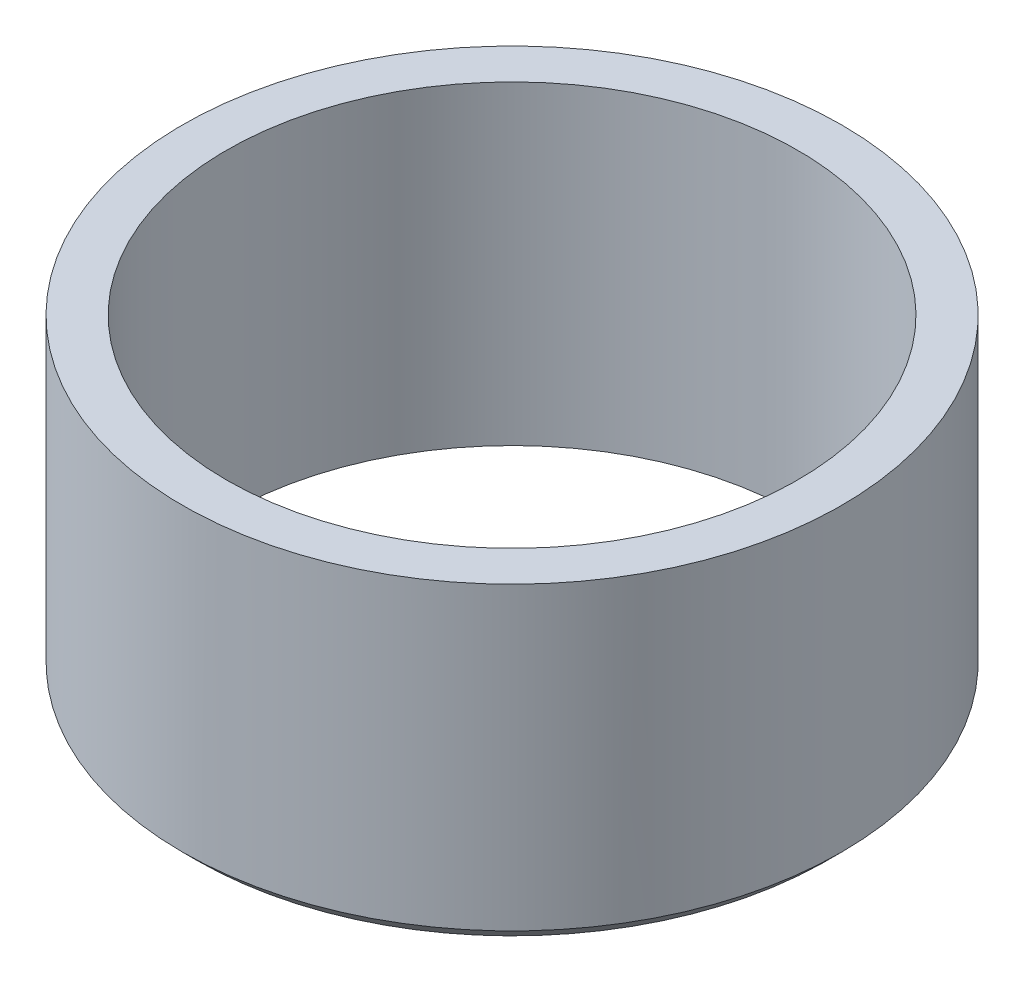
ISO-10303-21;
HEADER;
FILE_DESCRIPTION(('STEP AP214'),'2;1');
FILE_NAME('part.step','',(''),(''),'','','');
FILE_SCHEMA(('AUTOMOTIVE_DESIGN { 1 0 10303 214 1 1 1 1 }'));
ENDSEC;
DATA;
#1=APPLICATION_CONTEXT('core data for automotive mechanical design processes');
#2=APPLICATION_PROTOCOL_DEFINITION('international standard','automotive_design',2000,#1);
#3=PRODUCT_CONTEXT('',#1,'mechanical');
#4=PRODUCT('Part','Part','',(#3));
#5=PRODUCT_RELATED_PRODUCT_CATEGORY('part','',(#4));
#6=PRODUCT_DEFINITION_FORMATION('','',#4);
#7=PRODUCT_DEFINITION_CONTEXT('part definition',#1,'design');
#8=PRODUCT_DEFINITION('design','',#6,#7);
#9=PRODUCT_DEFINITION_SHAPE('','',#8);
#10=(LENGTH_UNIT() NAMED_UNIT(*) SI_UNIT(.MILLI.,.METRE.));
#11=(NAMED_UNIT(*) PLANE_ANGLE_UNIT() SI_UNIT($,.RADIAN.));
#12=(NAMED_UNIT(*) SI_UNIT($,.STERADIAN.) SOLID_ANGLE_UNIT());
#13=UNCERTAINTY_MEASURE_WITH_UNIT(LENGTH_MEASURE(1.E-05),#10,'distance_accuracy_value','');
#14=(GEOMETRIC_REPRESENTATION_CONTEXT(3) GLOBAL_UNCERTAINTY_ASSIGNED_CONTEXT((#13)) GLOBAL_UNIT_ASSIGNED_CONTEXT((#10,
#11,#12)) REPRESENTATION_CONTEXT('',''));
#15=CARTESIAN_POINT('',(0.,0.,0.));
#16=DIRECTION('',(0.,0.,1.));
#17=DIRECTION('',(1.,0.,0.));
#18=AXIS2_PLACEMENT_3D('',#15,#16,#17);
#19=CARTESIAN_POINT('',(0.,4.3,0.));
#20=DIRECTION('',(0.,-1.,0.));
#21=DIRECTION('',(0.,0.,-1.));
#22=AXIS2_PLACEMENT_3D('',#19,#20,#21);
#23=CYLINDRICAL_SURFACE('',#22,4.5);
#24=CARTESIAN_POINT('',(0.,0.200000000000006,0.));
#25=DIRECTION('',(0.,1.,0.));
#26=DIRECTION('',(0.,0.,1.));
#27=AXIS2_PLACEMENT_3D('',#24,#25,#26);
#28=CIRCLE('',#27,4.5);
#29=CARTESIAN_POINT('',(0.,0.200000000000005,-4.5));
#30=VERTEX_POINT('',#29);
#31=EDGE_CURVE('E38',#30,#30,#28,.T.);
#32=CARTESIAN_POINT('',(0.,4.3,0.));
#33=DIRECTION('',(0.,1.,0.));
#34=DIRECTION('',(0.,0.,1.));
#35=AXIS2_PLACEMENT_3D('',#32,#33,#34);
#36=CIRCLE('',#35,4.5);
#37=CARTESIAN_POINT('',(0.,4.3,-4.5));
#38=VERTEX_POINT('',#37);
#39=EDGE_CURVE('E42',#38,#38,#36,.T.);
#40=CARTESIAN_POINT('',(0.,0.200000000000005,-4.5));
#41=CARTESIAN_POINT('',(0.,0.242708333333338,-4.5));
#42=CARTESIAN_POINT('',(0.,0.285416666666671,-4.5));
#43=CARTESIAN_POINT('',(0.,0.370833333333338,-4.5));
#44=CARTESIAN_POINT('',(0.,0.413541666666671,-4.5));
#45=CARTESIAN_POINT('',(0.,0.498958333333337,-4.5));
#46=CARTESIAN_POINT('',(0.,0.54166666666667,-4.5));
#47=CARTESIAN_POINT('',(0.,0.627083333333337,-4.5));
#48=CARTESIAN_POINT('',(0.,0.669791666666671,-4.5));
#49=CARTESIAN_POINT('',(0.,0.755208333333337,-4.5));
#50=CARTESIAN_POINT('',(0.,0.79791666666667,-4.5));
#51=CARTESIAN_POINT('',(0.,0.883333333333337,-4.5));
#52=CARTESIAN_POINT('',(0.,0.92604166666667,-4.5));
#53=CARTESIAN_POINT('',(0.,1.01145833333334,-4.5));
#54=CARTESIAN_POINT('',(0.,1.05416666666667,-4.5));
#55=CARTESIAN_POINT('',(0.,1.13958333333334,-4.5));
#56=CARTESIAN_POINT('',(0.,1.18229166666667,-4.5));
#57=CARTESIAN_POINT('',(0.,1.26770833333334,-4.5));
#58=CARTESIAN_POINT('',(0.,1.31041666666667,-4.5));
#59=CARTESIAN_POINT('',(0.,1.39583333333334,-4.5));
#60=CARTESIAN_POINT('',(0.,1.43854166666667,-4.5));
#61=CARTESIAN_POINT('',(0.,1.52395833333334,-4.5));
#62=CARTESIAN_POINT('',(0.,1.56666666666667,-4.5));
#63=CARTESIAN_POINT('',(0.,1.65208333333334,-4.5));
#64=CARTESIAN_POINT('',(0.,1.69479166666667,-4.5));
#65=CARTESIAN_POINT('',(0.,1.78020833333334,-4.5));
#66=CARTESIAN_POINT('',(0.,1.82291666666667,-4.5));
#67=CARTESIAN_POINT('',(0.,1.90833333333334,-4.5));
#68=CARTESIAN_POINT('',(0.,1.95104166666667,-4.5));
#69=CARTESIAN_POINT('',(0.,2.03645833333334,-4.5));
#70=CARTESIAN_POINT('',(0.,2.07916666666667,-4.5));
#71=CARTESIAN_POINT('',(0.,2.16458333333334,-4.5));
#72=CARTESIAN_POINT('',(0.,2.20729166666667,-4.5));
#73=CARTESIAN_POINT('',(0.,2.29270833333334,-4.5));
#74=CARTESIAN_POINT('',(0.,2.33541666666667,-4.5));
#75=CARTESIAN_POINT('',(0.,2.42083333333334,-4.5));
#76=CARTESIAN_POINT('',(0.,2.46354166666667,-4.5));
#77=CARTESIAN_POINT('',(0.,2.54895833333333,-4.5));
#78=CARTESIAN_POINT('',(0.,2.59166666666667,-4.5));
#79=CARTESIAN_POINT('',(0.,2.67708333333333,-4.5));
#80=CARTESIAN_POINT('',(0.,2.71979166666667,-4.5));
#81=CARTESIAN_POINT('',(0.,2.80520833333333,-4.5));
#82=CARTESIAN_POINT('',(0.,2.84791666666667,-4.5));
#83=CARTESIAN_POINT('',(0.,2.93333333333333,-4.5));
#84=CARTESIAN_POINT('',(0.,2.97604166666667,-4.5));
#85=CARTESIAN_POINT('',(0.,3.06145833333333,-4.5));
#86=CARTESIAN_POINT('',(0.,3.10416666666667,-4.5));
#87=CARTESIAN_POINT('',(0.,3.18958333333333,-4.5));
#88=CARTESIAN_POINT('',(0.,3.23229166666667,-4.5));
#89=CARTESIAN_POINT('',(0.,3.31770833333333,-4.5));
#90=CARTESIAN_POINT('',(0.,3.36041666666667,-4.5));
#91=CARTESIAN_POINT('',(0.,3.44583333333333,-4.5));
#92=CARTESIAN_POINT('',(0.,3.48854166666667,-4.5));
#93=CARTESIAN_POINT('',(0.,3.57395833333333,-4.5));
#94=CARTESIAN_POINT('',(0.,3.61666666666667,-4.5));
#95=CARTESIAN_POINT('',(0.,3.70208333333333,-4.5));
#96=CARTESIAN_POINT('',(0.,3.74479166666667,-4.5));
#97=CARTESIAN_POINT('',(0.,3.83020833333333,-4.5));
#98=CARTESIAN_POINT('',(0.,3.87291666666667,-4.5));
#99=CARTESIAN_POINT('',(0.,3.95833333333333,-4.5));
#100=CARTESIAN_POINT('',(0.,4.00104166666667,-4.5));
#101=CARTESIAN_POINT('',(0.,4.08645833333333,-4.5));
#102=CARTESIAN_POINT('',(0.,4.12916666666667,-4.5));
#103=CARTESIAN_POINT('',(0.,4.21458333333333,-4.5));
#104=CARTESIAN_POINT('',(0.,4.25729166666667,-4.5));
#105=CARTESIAN_POINT('',(0.,4.3,-4.5));
#106=B_SPLINE_CURVE_WITH_KNOTS('',3,(#40,#41,#42,#43,#44,#45,#46,#47,#48,#49,#50,#51,#52,#53,
#54,#55,#56,#57,#58,#59,#60,#61,#62,#63,#64,#65,#66,#67,#68,#69,#70,#71,#72,#73,#74,#75,#76,#77,
#78,#79,#80,#81,#82,#83,#84,#85,#86,#87,#88,#89,#90,#91,#92,#93,#94,#95,#96,#97,#98,#99,#100,
#101,#102,#103,#104,#105),.UNSPECIFIED.,.F.,.F.,(4,2,2,2,2,2,2,2,2,2,2,2,2,2,2,2,2,2,2,2,2,2,2,
2,2,2,2,2,2,2,2,2,4),(0.,0.128125,0.256249999999999,0.384374999999999,0.512499999999999,
0.640624999999999,0.768749999999999,0.896874999999998,1.025,1.153125,1.28125,1.409375,1.5375,
1.665625,1.79375,1.921875,2.05,2.178125,2.30625,2.434375,2.5625,2.690625,2.81875,2.946875,3.075,
3.203125,3.33125,3.459375,3.58749999999999,3.71562499999999,3.84374999999999,3.97187499999999,
4.09999999999999),.UNSPECIFIED.);
#107=EDGE_CURVE('BSEAM31',#30,#38,#106,.T.);
#108=ORIENTED_EDGE('',*,*,#31,.T.);
#109=ORIENTED_EDGE('',*,*,#39,.F.);
#110=ORIENTED_EDGE('',*,*,#107,.T.);
#111=ORIENTED_EDGE('',*,*,#107,.F.);
#112=EDGE_LOOP('',(#108,#110,#109,#111));
#113=FACE_BOUND('',#112,.T.);
#114=ADVANCED_FACE('F31',(#113),#23,.T.);
#115=CARTESIAN_POINT('',(0.,4.3,0.));
#116=DIRECTION('',(0.,1.,0.));
#117=DIRECTION('',(0.,0.,1.));
#118=AXIS2_PLACEMENT_3D('',#115,#116,#117);
#119=PLANE('',#118);
#120=CARTESIAN_POINT('',(0.,4.3,0.));
#121=DIRECTION('',(0.,1.,0.));
#122=DIRECTION('',(0.,0.,1.));
#123=AXIS2_PLACEMENT_3D('',#120,#121,#122);
#124=CIRCLE('',#123,3.9);
#125=CARTESIAN_POINT('',(0.,4.3,3.9));
#126=VERTEX_POINT('',#125);
#127=EDGE_CURVE('E49',#126,#126,#124,.T.);
#128=ORIENTED_EDGE('',*,*,#127,.F.);
#129=EDGE_LOOP('',(#128));
#130=FACE_BOUND('',#129,.T.);
#131=ORIENTED_EDGE('',*,*,#39,.T.);
#132=EDGE_LOOP('',(#131));
#133=FACE_BOUND('',#132,.T.);
#134=ADVANCED_FACE('F63',(#130,#133),#119,.T.);
#135=CARTESIAN_POINT('',(0.,0.,0.));
#136=DIRECTION('',(0.,1.,0.));
#137=DIRECTION('',(0.,0.,1.));
#138=AXIS2_PLACEMENT_3D('',#135,#136,#137);
#139=PLANE('',#138);
#140=CARTESIAN_POINT('',(0.,0.,0.));
#141=DIRECTION('',(0.,1.,0.));
#142=DIRECTION('',(0.,0.,1.));
#143=AXIS2_PLACEMENT_3D('',#140,#141,#142);
#144=CIRCLE('',#143,4.29999999999999);
#145=CARTESIAN_POINT('',(0.,0.,4.29999999999999));
#146=VERTEX_POINT('',#145);
#147=EDGE_CURVE('E10',#146,#146,#144,.F.);
#148=ORIENTED_EDGE('',*,*,#147,.T.);
#149=EDGE_LOOP('',(#148));
#150=FACE_BOUND('',#149,.T.);
#151=CARTESIAN_POINT('',(0.,0.,0.));
#152=DIRECTION('',(0.,1.,0.));
#153=DIRECTION('',(0.,0.,1.));
#154=AXIS2_PLACEMENT_3D('',#151,#152,#153);
#155=CIRCLE('',#154,3.9);
#156=CARTESIAN_POINT('',(0.,0.,3.9));
#157=VERTEX_POINT('',#156);
#158=EDGE_CURVE('E46',#157,#157,#155,.T.);
#159=ORIENTED_EDGE('',*,*,#158,.T.);
#160=EDGE_LOOP('',(#159));
#161=FACE_BOUND('',#160,.T.);
#162=ADVANCED_FACE('F55',(#150,#161),#139,.F.);
#163=CARTESIAN_POINT('',(0.,0.,0.));
#164=DIRECTION('',(0.,1.,0.));
#165=DIRECTION('',(0.,0.,1.));
#166=AXIS2_PLACEMENT_3D('',#163,#164,#165);
#167=CYLINDRICAL_SURFACE('',#166,3.9);
#168=CARTESIAN_POINT('',(0.,0.,3.9));
#169=CARTESIAN_POINT('',(0.,0.0447916666666666,3.9));
#170=CARTESIAN_POINT('',(0.,0.0895833333333333,3.9));
#171=CARTESIAN_POINT('',(0.,0.179166666666667,3.9));
#172=CARTESIAN_POINT('',(0.,0.223958333333333,3.9));
#173=CARTESIAN_POINT('',(0.,0.313541666666667,3.9));
#174=CARTESIAN_POINT('',(0.,0.358333333333333,3.9));
#175=CARTESIAN_POINT('',(0.,0.447916666666667,3.9));
#176=CARTESIAN_POINT('',(0.,0.492708333333333,3.9));
#177=CARTESIAN_POINT('',(0.,0.582291666666667,3.9));
#178=CARTESIAN_POINT('',(0.,0.627083333333333,3.9));
#179=CARTESIAN_POINT('',(0.,0.716666666666667,3.9));
#180=CARTESIAN_POINT('',(0.,0.761458333333333,3.9));
#181=CARTESIAN_POINT('',(0.,0.851041666666667,3.9));
#182=CARTESIAN_POINT('',(0.,0.895833333333333,3.9));
#183=CARTESIAN_POINT('',(0.,0.985416666666667,3.9));
#184=CARTESIAN_POINT('',(0.,1.03020833333333,3.9));
#185=CARTESIAN_POINT('',(0.,1.11979166666667,3.9));
#186=CARTESIAN_POINT('',(0.,1.16458333333333,3.9));
#187=CARTESIAN_POINT('',(0.,1.25416666666667,3.9));
#188=CARTESIAN_POINT('',(0.,1.29895833333333,3.9));
#189=CARTESIAN_POINT('',(0.,1.38854166666667,3.9));
#190=CARTESIAN_POINT('',(0.,1.43333333333333,3.9));
#191=CARTESIAN_POINT('',(0.,1.52291666666667,3.9));
#192=CARTESIAN_POINT('',(0.,1.56770833333333,3.9));
#193=CARTESIAN_POINT('',(0.,1.65729166666667,3.9));
#194=CARTESIAN_POINT('',(0.,1.70208333333333,3.9));
#195=CARTESIAN_POINT('',(0.,1.79166666666667,3.9));
#196=CARTESIAN_POINT('',(0.,1.83645833333333,3.9));
#197=CARTESIAN_POINT('',(0.,1.92604166666667,3.9));
#198=CARTESIAN_POINT('',(0.,1.97083333333333,3.9));
#199=CARTESIAN_POINT('',(0.,2.06041666666667,3.9));
#200=CARTESIAN_POINT('',(0.,2.10520833333333,3.9));
#201=CARTESIAN_POINT('',(0.,2.19479166666667,3.9));
#202=CARTESIAN_POINT('',(0.,2.23958333333333,3.9));
#203=CARTESIAN_POINT('',(0.,2.32916666666667,3.9));
#204=CARTESIAN_POINT('',(0.,2.37395833333333,3.9));
#205=CARTESIAN_POINT('',(0.,2.46354166666667,3.9));
#206=CARTESIAN_POINT('',(0.,2.50833333333333,3.9));
#207=CARTESIAN_POINT('',(0.,2.59791666666667,3.9));
#208=CARTESIAN_POINT('',(0.,2.64270833333333,3.9));
#209=CARTESIAN_POINT('',(0.,2.73229166666667,3.9));
#210=CARTESIAN_POINT('',(0.,2.77708333333333,3.9));
#211=CARTESIAN_POINT('',(0.,2.86666666666667,3.9));
#212=CARTESIAN_POINT('',(0.,2.91145833333333,3.9));
#213=CARTESIAN_POINT('',(0.,3.00104166666667,3.9));
#214=CARTESIAN_POINT('',(0.,3.04583333333333,3.9));
#215=CARTESIAN_POINT('',(0.,3.13541666666667,3.9));
#216=CARTESIAN_POINT('',(0.,3.18020833333333,3.9));
#217=CARTESIAN_POINT('',(0.,3.26979166666667,3.9));
#218=CARTESIAN_POINT('',(0.,3.31458333333333,3.9));
#219=CARTESIAN_POINT('',(0.,3.40416666666667,3.9));
#220=CARTESIAN_POINT('',(0.,3.44895833333333,3.9));
#221=CARTESIAN_POINT('',(0.,3.53854166666667,3.9));
#222=CARTESIAN_POINT('',(0.,3.58333333333333,3.9));
#223=CARTESIAN_POINT('',(0.,3.67291666666667,3.9));
#224=CARTESIAN_POINT('',(0.,3.71770833333333,3.9));
#225=CARTESIAN_POINT('',(0.,3.80729166666667,3.9));
#226=CARTESIAN_POINT('',(0.,3.85208333333333,3.9));
#227=CARTESIAN_POINT('',(0.,3.94166666666667,3.9));
#228=CARTESIAN_POINT('',(0.,3.98645833333333,3.9));
#229=CARTESIAN_POINT('',(0.,4.07604166666667,3.9));
#230=CARTESIAN_POINT('',(0.,4.12083333333333,3.9));
#231=CARTESIAN_POINT('',(0.,4.21041666666667,3.9));
#232=CARTESIAN_POINT('',(0.,4.25520833333333,3.9));
#233=CARTESIAN_POINT('',(0.,4.3,3.9));
#234=B_SPLINE_CURVE_WITH_KNOTS('',3,(#168,#169,#170,#171,#172,#173,#174,#175,#176,#177,#178,
#179,#180,#181,#182,#183,#184,#185,#186,#187,#188,#189,#190,#191,#192,#193,#194,#195,#196,#197,
#198,#199,#200,#201,#202,#203,#204,#205,#206,#207,#208,#209,#210,#211,#212,#213,#214,#215,#216,
#217,#218,#219,#220,#221,#222,#223,#224,#225,#226,#227,#228,#229,#230,#231,#232,#233),
.UNSPECIFIED.,.F.,.F.,(4,2,2,2,2,2,2,2,2,2,2,2,2,2,2,2,2,2,2,2,2,2,2,2,2,2,2,2,2,2,2,2,4),(0.,
0.134375,0.26875,0.403125,0.5375,0.671875,0.80625,0.940625,1.075,1.209375,1.34375,1.478125,
1.6125,1.746875,1.88125,2.015625,2.15,2.284375,2.41875,2.553125,2.6875,2.821875,2.95625,
3.090625,3.225,3.359375,3.49375,3.628125,3.7625,3.896875,4.03125,4.165625,4.3),.UNSPECIFIED.);
#235=EDGE_CURVE('BSEAM57',#157,#126,#234,.T.);
#236=ORIENTED_EDGE('',*,*,#158,.F.);
#237=ORIENTED_EDGE('',*,*,#127,.T.);
#238=ORIENTED_EDGE('',*,*,#235,.T.);
#239=ORIENTED_EDGE('',*,*,#235,.F.);
#240=EDGE_LOOP('',(#236,#238,#237,#239));
#241=FACE_BOUND('',#240,.T.);
#242=ADVANCED_FACE('F57',(#241),#167,.F.);
#243=CARTESIAN_POINT('',(0.,0.200000000000005,0.));
#244=DIRECTION('',(0.,1.,0.));
#245=DIRECTION('',(0.,0.,1.));
#246=AXIS2_PLACEMENT_3D('',#243,#244,#245);
#247=CONICAL_SURFACE('',#246,4.5,0.78539816339745);
#248=ORIENTED_EDGE('',*,*,#147,.F.);
#249=EDGE_LOOP('',(#248));
#250=FACE_BOUND('',#249,.T.);
#251=ORIENTED_EDGE('',*,*,#31,.F.);
#252=EDGE_LOOP('',(#251));
#253=FACE_BOUND('',#252,.T.);
#254=ADVANCED_FACE('F33',(#250,#253),#247,.T.);
#255=CLOSED_SHELL('',(#114,#134,#162,#242,#254));
#256=MANIFOLD_SOLID_BREP('B2',#255);
#257=ADVANCED_BREP_SHAPE_REPRESENTATION('',(#18,#256),#14);
#258=SHAPE_DEFINITION_REPRESENTATION(#9,#257);
ENDSEC;
END-ISO-10303-21;
